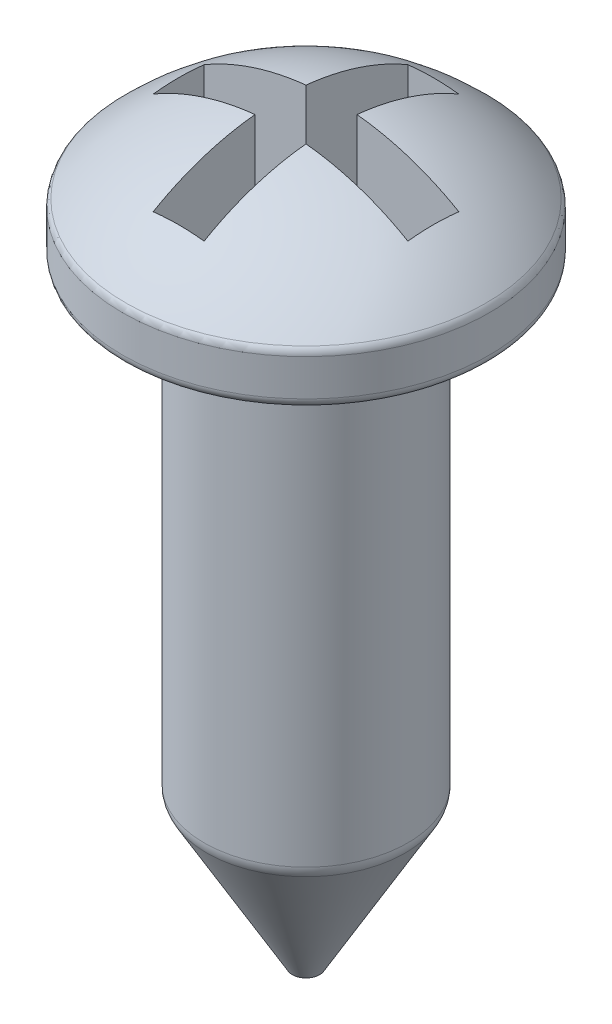
ISO-10303-21;
HEADER;
FILE_DESCRIPTION(('STEP AP214'),'2;1');
FILE_NAME('part.step','',(''),(''),'','','');
FILE_SCHEMA(('AUTOMOTIVE_DESIGN { 1 0 10303 214 1 1 1 1 }'));
ENDSEC;
DATA;
#1=APPLICATION_CONTEXT('core data for automotive mechanical design processes');
#2=APPLICATION_PROTOCOL_DEFINITION('international standard','automotive_design',2000,#1);
#3=PRODUCT_CONTEXT('',#1,'mechanical');
#4=PRODUCT('Part','Part','',(#3));
#5=PRODUCT_RELATED_PRODUCT_CATEGORY('part','',(#4));
#6=PRODUCT_DEFINITION_FORMATION('','',#4);
#7=PRODUCT_DEFINITION_CONTEXT('part definition',#1,'design');
#8=PRODUCT_DEFINITION('design','',#6,#7);
#9=PRODUCT_DEFINITION_SHAPE('','',#8);
#10=(LENGTH_UNIT() NAMED_UNIT(*) SI_UNIT(.MILLI.,.METRE.));
#11=(NAMED_UNIT(*) PLANE_ANGLE_UNIT() SI_UNIT($,.RADIAN.));
#12=(NAMED_UNIT(*) SI_UNIT($,.STERADIAN.) SOLID_ANGLE_UNIT());
#13=UNCERTAINTY_MEASURE_WITH_UNIT(LENGTH_MEASURE(1.E-05),#10,'distance_accuracy_value','');
#14=(GEOMETRIC_REPRESENTATION_CONTEXT(3) GLOBAL_UNCERTAINTY_ASSIGNED_CONTEXT((#13)) GLOBAL_UNIT_ASSIGNED_CONTEXT((#10,
#11,#12)) REPRESENTATION_CONTEXT('',''));
#15=CARTESIAN_POINT('',(0.,0.,0.));
#16=DIRECTION('',(0.,0.,1.));
#17=DIRECTION('',(1.,0.,0.));
#18=AXIS2_PLACEMENT_3D('',#15,#16,#17);
#19=CARTESIAN_POINT('',(0.,-1.2188961038961,0.));
#20=DIRECTION('',(0.,-1.,0.));
#21=DIRECTION('',(1.,0.,0.));
#22=AXIS2_PLACEMENT_3D('',#19,#20,#21);
#23=SPHERICAL_SURFACE('',#22,2.4888961038961);
#24=CARTESIAN_POINT('',(0.,0.529699603001643,0.));
#25=DIRECTION('',(0.,-1.,0.));
#26=DIRECTION('',(0.,0.,-1.));
#27=AXIS2_PLACEMENT_3D('',#24,#25,#26);
#28=CIRCLE('',#27,1.77116257576993);
#29=CARTESIAN_POINT('',(0.,0.529699603001643,-1.77116257576993));
#30=VERTEX_POINT('',#29);
#31=EDGE_CURVE('E197',#30,#30,#28,.F.);
#32=ORIENTED_EDGE('',*,*,#31,.T.);
#33=EDGE_LOOP('',(#32));
#34=FACE_BOUND('',#33,.T.);
#35=CARTESIAN_POINT('',(0.25,-1.2188961038961,0.));
#36=DIRECTION('',(-1.,0.,0.));
#37=DIRECTION('',(0.,0.,1.));
#38=AXIS2_PLACEMENT_3D('',#35,#36,#37);
#39=CIRCLE('',#38,2.47630850581853);
#40=CARTESIAN_POINT('',(0.25,1.24476049067815,-0.25));
#41=VERTEX_POINT('',#40);
#42=CARTESIAN_POINT('',(0.25,0.918767063206985,-1.25));
#43=VERTEX_POINT('',#42);
#44=EDGE_CURVE('E114',#41,#43,#39,.T.);
#45=ORIENTED_EDGE('',*,*,#44,.F.);
#46=CARTESIAN_POINT('',(0.,-1.2188961038961,-0.25));
#47=DIRECTION('',(0.,0.,-1.));
#48=DIRECTION('',(-1.,0.,0.));
#49=AXIS2_PLACEMENT_3D('',#46,#47,#48);
#50=CIRCLE('',#49,2.47630850581853);
#51=CARTESIAN_POINT('',(1.25,0.918767063206984,-0.25));
#52=VERTEX_POINT('',#51);
#53=EDGE_CURVE('E199',#41,#52,#50,.T.);
#54=ORIENTED_EDGE('',*,*,#53,.T.);
#55=CARTESIAN_POINT('',(1.25,-1.2188961038961,0.));
#56=DIRECTION('',(1.,0.,0.));
#57=DIRECTION('',(0.,0.,-1.));
#58=AXIS2_PLACEMENT_3D('',#55,#56,#57);
#59=CIRCLE('',#58,2.15223228671749);
#60=CARTESIAN_POINT('',(1.25,0.918767063206985,0.25));
#61=VERTEX_POINT('',#60);
#62=EDGE_CURVE('E204',#52,#61,#59,.T.);
#63=ORIENTED_EDGE('',*,*,#62,.T.);
#64=CARTESIAN_POINT('',(0.,-1.2188961038961,0.25));
#65=DIRECTION('',(0.,0.,1.));
#66=DIRECTION('',(1.,0.,0.));
#67=AXIS2_PLACEMENT_3D('',#64,#65,#66);
#68=CIRCLE('',#67,2.47630850581853);
#69=CARTESIAN_POINT('',(0.25,1.24476049067815,0.25));
#70=VERTEX_POINT('',#69);
#71=EDGE_CURVE('E208',#61,#70,#68,.T.);
#72=ORIENTED_EDGE('',*,*,#71,.T.);
#73=CARTESIAN_POINT('',(0.25,0.918767063206985,1.25));
#74=VERTEX_POINT('',#73);
#75=EDGE_CURVE('E151',#74,#70,#39,.T.);
#76=ORIENTED_EDGE('',*,*,#75,.F.);
#77=CARTESIAN_POINT('',(0.,-1.2188961038961,1.25));
#78=DIRECTION('',(0.,0.,-1.));
#79=DIRECTION('',(-1.,0.,0.));
#80=AXIS2_PLACEMENT_3D('',#77,#78,#79);
#81=CIRCLE('',#80,2.15223228671749);
#82=CARTESIAN_POINT('',(-0.25,0.918767063206985,1.25));
#83=VERTEX_POINT('',#82);
#84=EDGE_CURVE('E25',#83,#74,#81,.T.);
#85=ORIENTED_EDGE('',*,*,#84,.F.);
#86=CARTESIAN_POINT('',(-0.25,-1.2188961038961,0.));
#87=DIRECTION('',(1.,0.,0.));
#88=DIRECTION('',(0.,0.,-1.));
#89=AXIS2_PLACEMENT_3D('',#86,#87,#88);
#90=CIRCLE('',#89,2.47630850581853);
#91=CARTESIAN_POINT('',(-0.25,1.24476049067815,0.25));
#92=VERTEX_POINT('',#91);
#93=EDGE_CURVE('E144',#92,#83,#90,.T.);
#94=ORIENTED_EDGE('',*,*,#93,.F.);
#95=CARTESIAN_POINT('',(-1.25,0.918767063206985,0.25));
#96=VERTEX_POINT('',#95);
#97=EDGE_CURVE('E210',#92,#96,#68,.T.);
#98=ORIENTED_EDGE('',*,*,#97,.T.);
#99=CARTESIAN_POINT('',(-1.25,-1.2188961038961,0.));
#100=DIRECTION('',(-1.,0.,0.));
#101=DIRECTION('',(0.,0.,1.));
#102=AXIS2_PLACEMENT_3D('',#99,#100,#101);
#103=CIRCLE('',#102,2.15223228671749);
#104=CARTESIAN_POINT('',(-1.25,0.918767063206985,-0.25));
#105=VERTEX_POINT('',#104);
#106=EDGE_CURVE('E211',#96,#105,#103,.T.);
#107=ORIENTED_EDGE('',*,*,#106,.T.);
#108=CARTESIAN_POINT('',(-0.25,1.24476049067815,-0.25));
#109=VERTEX_POINT('',#108);
#110=EDGE_CURVE('E203',#105,#109,#50,.T.);
#111=ORIENTED_EDGE('',*,*,#110,.T.);
#112=CARTESIAN_POINT('',(-0.25,0.918767063206985,-1.25));
#113=VERTEX_POINT('',#112);
#114=EDGE_CURVE('E142',#113,#109,#90,.T.);
#115=ORIENTED_EDGE('',*,*,#114,.F.);
#116=CARTESIAN_POINT('',(0.,-1.2188961038961,-1.25));
#117=DIRECTION('',(0.,0.,1.));
#118=DIRECTION('',(1.,0.,0.));
#119=AXIS2_PLACEMENT_3D('',#116,#117,#118);
#120=CIRCLE('',#119,2.15223228671749);
#121=EDGE_CURVE('E11',#43,#113,#120,.T.);
#122=ORIENTED_EDGE('',*,*,#121,.F.);
#123=EDGE_LOOP('',(#45,#54,#63,#72,#76,#85,#94,#98,#107,#111,#115,#122));
#124=FACE_BOUND('',#123,.T.);
#125=ADVANCED_FACE('F17',(#34,#124),#23,.T.);
#126=CARTESIAN_POINT('',(1.25,5.1,0.25));
#127=DIRECTION('',(0.,0.,1.));
#128=DIRECTION('',(1.,0.,0.));
#129=AXIS2_PLACEMENT_3D('',#126,#127,#128);
#130=PLANE('',#129);
#131=DIRECTION('',(0.,-1.,0.));
#132=VECTOR('',#131,1.);
#133=CARTESIAN_POINT('',(0.25,5.1,0.25));
#134=LINE('',#133,#132);
#135=CARTESIAN_POINT('',(0.25,0.1,0.25));
#136=VERTEX_POINT('',#135);
#137=EDGE_CURVE('E147',#70,#136,#134,.T.);
#138=ORIENTED_EDGE('',*,*,#137,.F.);
#139=ORIENTED_EDGE('',*,*,#71,.F.);
#140=DIRECTION('',(0.,-1.,0.));
#141=VECTOR('',#140,1.);
#142=CARTESIAN_POINT('',(1.25,5.1,0.25));
#143=LINE('',#142,#141);
#144=CARTESIAN_POINT('',(1.25,0.1,0.25));
#145=VERTEX_POINT('',#144);
#146=EDGE_CURVE('E171',#61,#145,#143,.T.);
#147=ORIENTED_EDGE('',*,*,#146,.T.);
#148=DIRECTION('',(-1.,0.,0.));
#149=VECTOR('',#148,1.);
#150=CARTESIAN_POINT('',(1.25,0.1,0.25));
#151=LINE('',#150,#149);
#152=EDGE_CURVE('E162',#145,#136,#151,.T.);
#153=ORIENTED_EDGE('',*,*,#152,.T.);
#154=EDGE_LOOP('',(#138,#139,#147,#153));
#155=FACE_BOUND('',#154,.T.);
#156=ADVANCED_FACE('F229',(#155),#130,.F.);
#157=DIRECTION('',(0.,1.,0.));
#158=VECTOR('',#157,1.);
#159=CARTESIAN_POINT('',(-0.25,5.1,0.25));
#160=LINE('',#159,#158);
#161=CARTESIAN_POINT('',(-0.25,0.1,0.25));
#162=VERTEX_POINT('',#161);
#163=EDGE_CURVE('E145',#162,#92,#160,.T.);
#164=ORIENTED_EDGE('',*,*,#163,.F.);
#165=CARTESIAN_POINT('',(-1.25,0.1,0.25));
#166=VERTEX_POINT('',#165);
#167=EDGE_CURVE('E165',#162,#166,#151,.T.);
#168=ORIENTED_EDGE('',*,*,#167,.T.);
#169=DIRECTION('',(0.,-1.,0.));
#170=VECTOR('',#169,1.);
#171=CARTESIAN_POINT('',(-1.25,5.1,0.25));
#172=LINE('',#171,#170);
#173=EDGE_CURVE('E170',#96,#166,#172,.T.);
#174=ORIENTED_EDGE('',*,*,#173,.F.);
#175=ORIENTED_EDGE('',*,*,#97,.F.);
#176=EDGE_LOOP('',(#164,#168,#174,#175));
#177=FACE_BOUND('',#176,.T.);
#178=ADVANCED_FACE('F248',(#177),#130,.F.);
#179=CARTESIAN_POINT('',(1.25,5.1,-0.25));
#180=DIRECTION('',(0.,0.,-1.));
#181=DIRECTION('',(-1.,0.,0.));
#182=AXIS2_PLACEMENT_3D('',#179,#180,#181);
#183=PLANE('',#182);
#184=DIRECTION('',(0.,1.,0.));
#185=VECTOR('',#184,1.);
#186=CARTESIAN_POINT('',(0.25,5.1,-0.25));
#187=LINE('',#186,#185);
#188=CARTESIAN_POINT('',(0.25,0.1,-0.25));
#189=VERTEX_POINT('',#188);
#190=EDGE_CURVE('E150',#189,#41,#187,.T.);
#191=ORIENTED_EDGE('',*,*,#190,.F.);
#192=DIRECTION('',(1.,0.,0.));
#193=VECTOR('',#192,1.);
#194=CARTESIAN_POINT('',(1.25,0.1,-0.25));
#195=LINE('',#194,#193);
#196=CARTESIAN_POINT('',(1.25,0.1,-0.25));
#197=VERTEX_POINT('',#196);
#198=EDGE_CURVE('E121',#189,#197,#195,.T.);
#199=ORIENTED_EDGE('',*,*,#198,.T.);
#200=DIRECTION('',(0.,-1.,0.));
#201=VECTOR('',#200,1.);
#202=CARTESIAN_POINT('',(1.25,5.1,-0.25));
#203=LINE('',#202,#201);
#204=EDGE_CURVE('E174',#52,#197,#203,.T.);
#205=ORIENTED_EDGE('',*,*,#204,.F.);
#206=ORIENTED_EDGE('',*,*,#53,.F.);
#207=EDGE_LOOP('',(#191,#199,#205,#206));
#208=FACE_BOUND('',#207,.T.);
#209=ADVANCED_FACE('F235',(#208),#183,.F.);
#210=DIRECTION('',(0.,-1.,0.));
#211=VECTOR('',#210,1.);
#212=CARTESIAN_POINT('',(-0.25,5.1,-0.25));
#213=LINE('',#212,#211);
#214=CARTESIAN_POINT('',(-0.25,0.1,-0.25));
#215=VERTEX_POINT('',#214);
#216=EDGE_CURVE('E117',#109,#215,#213,.T.);
#217=ORIENTED_EDGE('',*,*,#216,.F.);
#218=ORIENTED_EDGE('',*,*,#110,.F.);
#219=DIRECTION('',(0.,-1.,0.));
#220=VECTOR('',#219,1.);
#221=CARTESIAN_POINT('',(-1.25,5.1,-0.25));
#222=LINE('',#221,#220);
#223=CARTESIAN_POINT('',(-1.25,0.1,-0.25));
#224=VERTEX_POINT('',#223);
#225=EDGE_CURVE('E167',#105,#224,#222,.T.);
#226=ORIENTED_EDGE('',*,*,#225,.T.);
#227=EDGE_CURVE('E156',#224,#215,#195,.T.);
#228=ORIENTED_EDGE('',*,*,#227,.T.);
#229=EDGE_LOOP('',(#217,#218,#226,#228));
#230=FACE_BOUND('',#229,.T.);
#231=ADVANCED_FACE('F239',(#230),#183,.F.);
#232=CARTESIAN_POINT('',(0.,0.,0.));
#233=DIRECTION('',(0.,1.,0.));
#234=DIRECTION('',(0.,0.,1.));
#235=AXIS2_PLACEMENT_3D('',#232,#233,#234);
#236=PLANE('',#235);
#237=CARTESIAN_POINT('',(0.,0.,0.));
#238=DIRECTION('',(0.,1.,0.));
#239=DIRECTION('',(0.,0.,1.));
#240=AXIS2_PLACEMENT_3D('',#237,#238,#239);
#241=CIRCLE('',#240,1.7);
#242=CARTESIAN_POINT('',(0.,0.,1.7));
#243=VERTEX_POINT('',#242);
#244=EDGE_CURVE('E187',#243,#243,#241,.F.);
#245=ORIENTED_EDGE('',*,*,#244,.T.);
#246=EDGE_LOOP('',(#245));
#247=FACE_BOUND('',#246,.T.);
#248=CARTESIAN_POINT('',(0.,0.,0.));
#249=DIRECTION('',(0.,1.,0.));
#250=DIRECTION('',(0.,0.,1.));
#251=AXIS2_PLACEMENT_3D('',#248,#249,#250);
#252=CIRCLE('',#251,1.);
#253=CARTESIAN_POINT('',(0.,0.,1.));
#254=VERTEX_POINT('',#253);
#255=EDGE_CURVE('E168',#254,#254,#252,.F.);
#256=ORIENTED_EDGE('',*,*,#255,.F.);
#257=EDGE_LOOP('',(#256));
#258=FACE_BOUND('',#257,.T.);
#259=ADVANCED_FACE('F296',(#247,#258),#236,.F.);
#260=CARTESIAN_POINT('',(0.,0.,0.));
#261=DIRECTION('',(0.,-1.,0.));
#262=DIRECTION('',(0.,0.,-1.));
#263=AXIS2_PLACEMENT_3D('',#260,#261,#262);
#264=CYLINDRICAL_SURFACE('',#263,1.8);
#265=CARTESIAN_POINT('',(0.,0.1,0.));
#266=DIRECTION('',(0.,1.,0.));
#267=DIRECTION('',(0.,0.,1.));
#268=AXIS2_PLACEMENT_3D('',#265,#266,#267);
#269=CIRCLE('',#268,1.8);
#270=CARTESIAN_POINT('',(0.,0.1,1.8));
#271=VERTEX_POINT('',#270);
#272=EDGE_CURVE('E191',#271,#271,#269,.T.);
#273=ORIENTED_EDGE('',*,*,#272,.T.);
#274=EDGE_LOOP('',(#273));
#275=FACE_BOUND('',#274,.T.);
#276=CARTESIAN_POINT('',(0.,0.459443729156185,0.));
#277=DIRECTION('',(0.,-1.,0.));
#278=DIRECTION('',(0.,0.,-1.));
#279=AXIS2_PLACEMENT_3D('',#276,#277,#278);
#280=CIRCLE('',#279,1.8);
#281=CARTESIAN_POINT('',(0.,0.459443729156185,-1.8));
#282=VERTEX_POINT('',#281);
#283=EDGE_CURVE('E192',#282,#282,#280,.T.);
#284=ORIENTED_EDGE('',*,*,#283,.T.);
#285=EDGE_LOOP('',(#284));
#286=FACE_BOUND('',#285,.T.);
#287=ADVANCED_FACE('F273',(#275,#286),#264,.T.);
#288=CARTESIAN_POINT('',(0.,-6.,0.));
#289=DIRECTION('',(0.,1.,0.));
#290=DIRECTION('',(0.,0.,1.));
#291=AXIS2_PLACEMENT_3D('',#288,#289,#290);
#292=CYLINDRICAL_SURFACE('',#291,1.);
#293=CARTESIAN_POINT('',(0.,-4.44641016151376,0.));
#294=DIRECTION('',(0.,-1.,0.));
#295=DIRECTION('',(0.,0.,-1.));
#296=AXIS2_PLACEMENT_3D('',#293,#294,#295);
#297=CIRCLE('',#296,1.);
#298=CARTESIAN_POINT('',(0.,-4.44641016151376,-1.));
#299=VERTEX_POINT('',#298);
#300=EDGE_CURVE('E181',#299,#299,#297,.F.);
#301=ORIENTED_EDGE('',*,*,#300,.T.);
#302=EDGE_LOOP('',(#301));
#303=FACE_BOUND('',#302,.T.);
#304=ORIENTED_EDGE('',*,*,#255,.T.);
#305=EDGE_LOOP('',(#304));
#306=FACE_BOUND('',#305,.T.);
#307=ADVANCED_FACE('F302',(#303,#306),#292,.T.);
#308=CARTESIAN_POINT('',(0.,-6.,0.));
#309=DIRECTION('',(0.,-1.,0.));
#310=DIRECTION('',(0.,0.,-1.));
#311=AXIS2_PLACEMENT_3D('',#308,#309,#310);
#312=PLANE('',#311);
#313=CARTESIAN_POINT('',(0.,-6.,0.));
#314=DIRECTION('',(0.,-1.,0.));
#315=DIRECTION('',(0.,0.,-1.));
#316=AXIS2_PLACEMENT_3D('',#313,#314,#315);
#317=CIRCLE('',#316,0.133974596215561);
#318=CARTESIAN_POINT('',(0.,-6.,0.133974596215561));
#319=VERTEX_POINT('',#318);
#320=EDGE_CURVE('E180',#319,#319,#317,.T.);
#321=ORIENTED_EDGE('',*,*,#320,.T.);
#322=EDGE_LOOP('',(#321));
#323=FACE_BOUND('',#322,.T.);
#324=ADVANCED_FACE('F278',(#323),#312,.T.);
#325=CARTESIAN_POINT('',(0.,-6.,0.));
#326=DIRECTION('',(0.,1.,0.));
#327=DIRECTION('',(0.,0.,1.));
#328=AXIS2_PLACEMENT_3D('',#325,#326,#327);
#329=CONICAL_SURFACE('',#328,0.133974596215561,0.523598775598298);
#330=CARTESIAN_POINT('',(0.,-4.54641016151377,0.));
#331=DIRECTION('',(0.,1.,0.));
#332=DIRECTION('',(0.,0.,1.));
#333=AXIS2_PLACEMENT_3D('',#330,#331,#332);
#334=CIRCLE('',#333,0.973205080756888);
#335=CARTESIAN_POINT('',(0.,-4.54641016151377,0.973205080756889));
#336=VERTEX_POINT('',#335);
#337=EDGE_CURVE('E184',#336,#336,#334,.F.);
#338=CARTESIAN_POINT('',(0.,-4.54641016151377,0.973205080756889));
#339=CARTESIAN_POINT('',(0.,-4.56155172233134,0.964463096542917));
#340=CARTESIAN_POINT('',(0.,-4.5766932831489,0.955721112328945));
#341=CARTESIAN_POINT('',(0.,-4.60697640478403,0.938237143901));
#342=CARTESIAN_POINT('',(0.,-4.62211796560159,0.929495159687028));
#343=CARTESIAN_POINT('',(0.,-4.65240108723672,0.912011191259083));
#344=CARTESIAN_POINT('',(0.,-4.66754264805429,0.903269207045111));
#345=CARTESIAN_POINT('',(0.,-4.69782576968942,0.885785238617167));
#346=CARTESIAN_POINT('',(0.,-4.71296733050698,0.877043254403195));
#347=CARTESIAN_POINT('',(0.,-4.74325045214211,0.85955928597525));
#348=CARTESIAN_POINT('',(0.,-4.75839201295968,0.850817301761278));
#349=CARTESIAN_POINT('',(0.,-4.78867513459481,0.833333333333334));
#350=CARTESIAN_POINT('',(0.,-4.80381669541237,0.824591349119362));
#351=CARTESIAN_POINT('',(0.,-4.8340998170475,0.807107380691418));
#352=CARTESIAN_POINT('',(0.,-4.84924137786507,0.798365396477445));
#353=CARTESIAN_POINT('',(0.,-4.8795244995002,0.780881428049501));
#354=CARTESIAN_POINT('',(0.,-4.89466606031776,0.772139443835529));
#355=CARTESIAN_POINT('',(0.,-4.92494918195289,0.754655475407584));
#356=CARTESIAN_POINT('',(0.,-4.94009074277046,0.745913491193612));
#357=CARTESIAN_POINT('',(0.,-4.97037386440559,0.728429522765668));
#358=CARTESIAN_POINT('',(0.,-4.98551542522315,0.719687538551696));
#359=CARTESIAN_POINT('',(0.,-5.01579854685828,0.702203570123751));
#360=CARTESIAN_POINT('',(0.,-5.03094010767585,0.693461585909779));
#361=CARTESIAN_POINT('',(0.,-5.06122322931098,0.675977617481835));
#362=CARTESIAN_POINT('',(0.,-5.07636479012854,0.667235633267863));
#363=CARTESIAN_POINT('',(0.,-5.10664791176367,0.649751664839919));
#364=CARTESIAN_POINT('',(0.,-5.12178947258124,0.641009680625946));
#365=CARTESIAN_POINT('',(0.,-5.15207259421637,0.623525712198002));
#366=CARTESIAN_POINT('',(0.,-5.16721415503393,0.61478372798403));
#367=CARTESIAN_POINT('',(0.,-5.19749727666906,0.597299759556086));
#368=CARTESIAN_POINT('',(0.,-5.21263883748663,0.588557775342114));
#369=CARTESIAN_POINT('',(0.,-5.24292195912176,0.571073806914169));
#370=CARTESIAN_POINT('',(0.,-5.25806351993932,0.562331822700197));
#371=CARTESIAN_POINT('',(0.,-5.28834664157445,0.544847854272253));
#372=CARTESIAN_POINT('',(0.,-5.30348820239201,0.53610587005828));
#373=CARTESIAN_POINT('',(0.,-5.33377132402714,0.518621901630336));
#374=CARTESIAN_POINT('',(0.,-5.34891288484471,0.509879917416364));
#375=CARTESIAN_POINT('',(0.,-5.37919600647984,0.49239594898842));
#376=CARTESIAN_POINT('',(0.,-5.3943375672974,0.483653964774447));
#377=CARTESIAN_POINT('',(0.,-5.42462068893253,0.466169996346503));
#378=CARTESIAN_POINT('',(0.,-5.4397622497501,0.457428012132531));
#379=CARTESIAN_POINT('',(0.,-5.47004537138523,0.439944043704587));
#380=CARTESIAN_POINT('',(0.,-5.48518693220279,0.431202059490614));
#381=CARTESIAN_POINT('',(0.,-5.51547005383792,0.41371809106267));
#382=CARTESIAN_POINT('',(0.,-5.53061161465549,0.404976106848698));
#383=CARTESIAN_POINT('',(0.,-5.56089473629062,0.387492138420754));
#384=CARTESIAN_POINT('',(0.,-5.57603629710818,0.378750154206781));
#385=CARTESIAN_POINT('',(0.,-5.60631941874331,0.361266185778837));
#386=CARTESIAN_POINT('',(0.,-5.62146097956088,0.352524201564865));
#387=CARTESIAN_POINT('',(0.,-5.65174410119601,0.335040233136921));
#388=CARTESIAN_POINT('',(0.,-5.66688566201357,0.326298248922948));
#389=CARTESIAN_POINT('',(0.,-5.6971687836487,0.308814280495004));
#390=CARTESIAN_POINT('',(0.,-5.71231034446627,0.300072296281032));
#391=CARTESIAN_POINT('',(0.,-5.7425934661014,0.282588327853088));
#392=CARTESIAN_POINT('',(0.,-5.75773502691896,0.273846343639115));
#393=CARTESIAN_POINT('',(0.,-5.78801814855409,0.256362375211171));
#394=CARTESIAN_POINT('',(0.,-5.80315970937166,0.247620390997199));
#395=CARTESIAN_POINT('',(0.,-5.83344283100679,0.230136422569255));
#396=CARTESIAN_POINT('',(0.,-5.84858439182435,0.221394438355282));
#397=CARTESIAN_POINT('',(0.,-5.87886751345948,0.203910469927338));
#398=CARTESIAN_POINT('',(0.,-5.89400907427705,0.195168485713366));
#399=CARTESIAN_POINT('',(0.,-5.92429219591218,0.177684517285422));
#400=CARTESIAN_POINT('',(0.,-5.93943375672974,0.16894253307145));
#401=CARTESIAN_POINT('',(0.,-5.96971687836487,0.151458564643505));
#402=CARTESIAN_POINT('',(0.,-5.98485843918243,0.142716580429533));
#403=CARTESIAN_POINT('',(0.,-6.,0.133974596215561));
#404=B_SPLINE_CURVE_WITH_KNOTS('',3,(#338,#339,#340,#341,#342,#343,#344,#345,#346,#347,#348,
#349,#350,#351,#352,#353,#354,#355,#356,#357,#358,#359,#360,#361,#362,#363,#364,#365,#366,#367,
#368,#369,#370,#371,#372,#373,#374,#375,#376,#377,#378,#379,#380,#381,#382,#383,#384,#385,#386,
#387,#388,#389,#390,#391,#392,#393,#394,#395,#396,#397,#398,#399,#400,#401,#402,#403),
.UNSPECIFIED.,.F.,.F.,(4,2,2,2,2,2,2,2,2,2,2,2,2,2,2,2,2,2,2,2,2,2,2,2,2,2,2,2,2,2,2,2,4),(0.,
0.0524519052838338,0.104903810567666,0.1573557158515,0.209807621135332,0.262259526419165,
0.314711431702998,0.367163336986831,0.419615242270664,0.472067147554498,0.524519052838331,
0.576970958122164,0.629422863405997,0.68187476868983,0.734326673973663,0.786778579257496,
0.839230484541329,0.891682389825162,0.944134295108995,0.996586200392828,1.04903810567666,
1.10149001096049,1.15394191624433,1.20639382152816,1.25884572681199,1.31129763209583,
1.36374953737966,1.41620144266349,1.46865334794733,1.52110525323116,1.57355715851499,
1.62600906379882,1.67846096908266),.UNSPECIFIED.);
#405=EDGE_CURVE('BSEAM277',#336,#319,#404,.T.);
#406=ORIENTED_EDGE('',*,*,#337,.T.);
#407=ORIENTED_EDGE('',*,*,#320,.F.);
#408=ORIENTED_EDGE('',*,*,#405,.T.);
#409=ORIENTED_EDGE('',*,*,#405,.F.);
#410=EDGE_LOOP('',(#406,#408,#407,#409));
#411=FACE_BOUND('',#410,.T.);
#412=ADVANCED_FACE('F277',(#411),#329,.T.);
#413=CARTESIAN_POINT('',(0.,-4.44641016151376,0.));
#414=DIRECTION('',(0.,-1.,0.));
#415=DIRECTION('',(0.,0.,-1.));
#416=AXIS2_PLACEMENT_3D('',#413,#414,#415);
#417=TOROIDAL_SURFACE('',#416,0.8,0.2);
#418=ORIENTED_EDGE('',*,*,#337,.F.);
#419=EDGE_LOOP('',(#418));
#420=FACE_BOUND('',#419,.T.);
#421=ORIENTED_EDGE('',*,*,#300,.F.);
#422=EDGE_LOOP('',(#421));
#423=FACE_BOUND('',#422,.T.);
#424=ADVANCED_FACE('F276',(#420,#423),#417,.T.);
#425=CARTESIAN_POINT('',(0.,0.1,0.));
#426=DIRECTION('',(0.,1.,0.));
#427=DIRECTION('',(0.,0.,1.));
#428=AXIS2_PLACEMENT_3D('',#425,#426,#427);
#429=TOROIDAL_SURFACE('',#428,1.7,0.1);
#430=ORIENTED_EDGE('',*,*,#272,.F.);
#431=EDGE_LOOP('',(#430));
#432=FACE_BOUND('',#431,.T.);
#433=ORIENTED_EDGE('',*,*,#244,.F.);
#434=EDGE_LOOP('',(#433));
#435=FACE_BOUND('',#434,.T.);
#436=ADVANCED_FACE('F284',(#432,#435),#429,.T.);
#437=CARTESIAN_POINT('',(0.,0.459443729156185,0.));
#438=DIRECTION('',(0.,-1.,0.));
#439=DIRECTION('',(0.,0.,-1.));
#440=AXIS2_PLACEMENT_3D('',#437,#438,#439);
#441=TOROIDAL_SURFACE('',#440,1.7,0.1);
#442=ORIENTED_EDGE('',*,*,#31,.F.);
#443=EDGE_LOOP('',(#442));
#444=FACE_BOUND('',#443,.T.);
#445=ORIENTED_EDGE('',*,*,#283,.F.);
#446=EDGE_LOOP('',(#445));
#447=FACE_BOUND('',#446,.T.);
#448=ADVANCED_FACE('F19',(#444,#447),#441,.T.);
#449=CARTESIAN_POINT('',(-1.25,5.1,0.25));
#450=DIRECTION('',(-1.,0.,0.));
#451=DIRECTION('',(0.,0.,1.));
#452=AXIS2_PLACEMENT_3D('',#449,#450,#451);
#453=PLANE('',#452);
#454=ORIENTED_EDGE('',*,*,#173,.T.);
#455=DIRECTION('',(0.,0.,-1.));
#456=VECTOR('',#455,1.);
#457=CARTESIAN_POINT('',(-1.25,0.1,0.25));
#458=LINE('',#457,#456);
#459=EDGE_CURVE('E153',#166,#224,#458,.T.);
#460=ORIENTED_EDGE('',*,*,#459,.T.);
#461=ORIENTED_EDGE('',*,*,#225,.F.);
#462=ORIENTED_EDGE('',*,*,#106,.F.);
#463=EDGE_LOOP('',(#454,#460,#461,#462));
#464=FACE_BOUND('',#463,.T.);
#465=ADVANCED_FACE('F243',(#464),#453,.F.);
#466=CARTESIAN_POINT('',(1.25,5.1,0.25));
#467=DIRECTION('',(1.,0.,0.));
#468=DIRECTION('',(0.,0.,-1.));
#469=AXIS2_PLACEMENT_3D('',#466,#467,#468);
#470=PLANE('',#469);
#471=ORIENTED_EDGE('',*,*,#204,.T.);
#472=DIRECTION('',(0.,0.,1.));
#473=VECTOR('',#472,1.);
#474=CARTESIAN_POINT('',(1.25,0.1,0.25));
#475=LINE('',#474,#473);
#476=EDGE_CURVE('E157',#197,#145,#475,.T.);
#477=ORIENTED_EDGE('',*,*,#476,.T.);
#478=ORIENTED_EDGE('',*,*,#146,.F.);
#479=ORIENTED_EDGE('',*,*,#62,.F.);
#480=EDGE_LOOP('',(#471,#477,#478,#479));
#481=FACE_BOUND('',#480,.T.);
#482=ADVANCED_FACE('F230',(#481),#470,.F.);
#483=CARTESIAN_POINT('',(0.,0.1,0.));
#484=DIRECTION('',(0.,1.,0.));
#485=DIRECTION('',(0.,0.,1.));
#486=AXIS2_PLACEMENT_3D('',#483,#484,#485);
#487=PLANE('',#486);
#488=ORIENTED_EDGE('',*,*,#167,.F.);
#489=DIRECTION('',(0.,0.,1.));
#490=VECTOR('',#489,1.);
#491=CARTESIAN_POINT('',(-0.25,0.1,1.25));
#492=LINE('',#491,#490);
#493=CARTESIAN_POINT('',(-0.25,0.1,1.25));
#494=VERTEX_POINT('',#493);
#495=EDGE_CURVE('E127',#162,#494,#492,.T.);
#496=ORIENTED_EDGE('',*,*,#495,.T.);
#497=DIRECTION('',(1.,0.,0.));
#498=VECTOR('',#497,1.);
#499=CARTESIAN_POINT('',(-0.25,0.1,1.25));
#500=LINE('',#499,#498);
#501=CARTESIAN_POINT('',(0.25,0.1,1.25));
#502=VERTEX_POINT('',#501);
#503=EDGE_CURVE('E133',#494,#502,#500,.T.);
#504=ORIENTED_EDGE('',*,*,#503,.T.);
#505=DIRECTION('',(0.,0.,-1.));
#506=VECTOR('',#505,1.);
#507=CARTESIAN_POINT('',(0.25,0.1,1.25));
#508=LINE('',#507,#506);
#509=EDGE_CURVE('E39',#502,#136,#508,.T.);
#510=ORIENTED_EDGE('',*,*,#509,.T.);
#511=ORIENTED_EDGE('',*,*,#152,.F.);
#512=ORIENTED_EDGE('',*,*,#476,.F.);
#513=ORIENTED_EDGE('',*,*,#198,.F.);
#514=CARTESIAN_POINT('',(0.25,0.1,-1.25));
#515=VERTEX_POINT('',#514);
#516=EDGE_CURVE('E109',#189,#515,#508,.T.);
#517=ORIENTED_EDGE('',*,*,#516,.T.);
#518=DIRECTION('',(-1.,0.,0.));
#519=VECTOR('',#518,1.);
#520=CARTESIAN_POINT('',(-0.25,0.1,-1.25));
#521=LINE('',#520,#519);
#522=CARTESIAN_POINT('',(-0.25,0.1,-1.25));
#523=VERTEX_POINT('',#522);
#524=EDGE_CURVE('E122',#515,#523,#521,.T.);
#525=ORIENTED_EDGE('',*,*,#524,.T.);
#526=EDGE_CURVE('E32',#523,#215,#492,.T.);
#527=ORIENTED_EDGE('',*,*,#526,.T.);
#528=ORIENTED_EDGE('',*,*,#227,.F.);
#529=ORIENTED_EDGE('',*,*,#459,.F.);
#530=EDGE_LOOP('',(#488,#496,#504,#510,#511,#512,#513,#517,#525,#527,#528,#529));
#531=FACE_BOUND('',#530,.T.);
#532=ADVANCED_FACE('F124',(#531),#487,.T.);
#533=CARTESIAN_POINT('',(-0.25,1.25741240192243,1.25));
#534=DIRECTION('',(1.,0.,0.));
#535=DIRECTION('',(0.,0.,-1.));
#536=AXIS2_PLACEMENT_3D('',#533,#534,#535);
#537=PLANE('',#536);
#538=ORIENTED_EDGE('',*,*,#114,.T.);
#539=ORIENTED_EDGE('',*,*,#216,.T.);
#540=ORIENTED_EDGE('',*,*,#526,.F.);
#541=DIRECTION('',(0.,-1.,0.));
#542=VECTOR('',#541,1.);
#543=CARTESIAN_POINT('',(-0.25,1.25741240192243,-1.25));
#544=LINE('',#543,#542);
#545=EDGE_CURVE('E119',#113,#523,#544,.T.);
#546=ORIENTED_EDGE('',*,*,#545,.F.);
#547=EDGE_LOOP('',(#538,#539,#540,#546));
#548=FACE_BOUND('',#547,.T.);
#549=ADVANCED_FACE('F236',(#548),#537,.T.);
#550=CARTESIAN_POINT('',(0.25,1.25741240192243,1.25));
#551=DIRECTION('',(-1.,0.,0.));
#552=DIRECTION('',(0.,0.,1.));
#553=AXIS2_PLACEMENT_3D('',#550,#551,#552);
#554=PLANE('',#553);
#555=ORIENTED_EDGE('',*,*,#44,.T.);
#556=DIRECTION('',(0.,-1.,0.));
#557=VECTOR('',#556,1.);
#558=CARTESIAN_POINT('',(0.25,1.25741240192243,-1.25));
#559=LINE('',#558,#557);
#560=EDGE_CURVE('E110',#43,#515,#559,.T.);
#561=ORIENTED_EDGE('',*,*,#560,.T.);
#562=ORIENTED_EDGE('',*,*,#516,.F.);
#563=ORIENTED_EDGE('',*,*,#190,.T.);
#564=EDGE_LOOP('',(#555,#561,#562,#563));
#565=FACE_BOUND('',#564,.T.);
#566=ADVANCED_FACE('F108',(#565),#554,.T.);
#567=CARTESIAN_POINT('',(-0.25,1.25741240192243,-1.25));
#568=DIRECTION('',(0.,0.,1.));
#569=DIRECTION('',(1.,0.,0.));
#570=AXIS2_PLACEMENT_3D('',#567,#568,#569);
#571=PLANE('',#570);
#572=ORIENTED_EDGE('',*,*,#121,.T.);
#573=ORIENTED_EDGE('',*,*,#545,.T.);
#574=ORIENTED_EDGE('',*,*,#524,.F.);
#575=ORIENTED_EDGE('',*,*,#560,.F.);
#576=EDGE_LOOP('',(#572,#573,#574,#575));
#577=FACE_BOUND('',#576,.T.);
#578=ADVANCED_FACE('F126',(#577),#571,.T.);
#579=CARTESIAN_POINT('',(-0.25,1.25741240192243,1.25));
#580=DIRECTION('',(0.,0.,-1.));
#581=DIRECTION('',(-1.,0.,0.));
#582=AXIS2_PLACEMENT_3D('',#579,#580,#581);
#583=PLANE('',#582);
#584=ORIENTED_EDGE('',*,*,#84,.T.);
#585=DIRECTION('',(0.,-1.,0.));
#586=VECTOR('',#585,1.);
#587=CARTESIAN_POINT('',(0.25,1.25741240192243,1.25));
#588=LINE('',#587,#586);
#589=EDGE_CURVE('E137',#74,#502,#588,.T.);
#590=ORIENTED_EDGE('',*,*,#589,.T.);
#591=ORIENTED_EDGE('',*,*,#503,.F.);
#592=DIRECTION('',(0.,-1.,0.));
#593=VECTOR('',#592,1.);
#594=CARTESIAN_POINT('',(-0.25,1.25741240192243,1.25));
#595=LINE('',#594,#593);
#596=EDGE_CURVE('E139',#83,#494,#595,.T.);
#597=ORIENTED_EDGE('',*,*,#596,.F.);
#598=EDGE_LOOP('',(#584,#590,#591,#597));
#599=FACE_BOUND('',#598,.T.);
#600=ADVANCED_FACE('F220',(#599),#583,.T.);
#601=ORIENTED_EDGE('',*,*,#75,.T.);
#602=ORIENTED_EDGE('',*,*,#137,.T.);
#603=ORIENTED_EDGE('',*,*,#509,.F.);
#604=ORIENTED_EDGE('',*,*,#589,.F.);
#605=EDGE_LOOP('',(#601,#602,#603,#604));
#606=FACE_BOUND('',#605,.T.);
#607=ADVANCED_FACE('F224',(#606),#554,.T.);
#608=ORIENTED_EDGE('',*,*,#93,.T.);
#609=ORIENTED_EDGE('',*,*,#596,.T.);
#610=ORIENTED_EDGE('',*,*,#495,.F.);
#611=ORIENTED_EDGE('',*,*,#163,.T.);
#612=EDGE_LOOP('',(#608,#609,#610,#611));
#613=FACE_BOUND('',#612,.T.);
#614=ADVANCED_FACE('F252',(#613),#537,.T.);
#615=CLOSED_SHELL('',(#125,#156,#178,#209,#231,#259,#287,#307,#324,#412,#424,#436,#448,#465,
#482,#532,#549,#566,#578,#600,#607,#614));
#616=MANIFOLD_SOLID_BREP('B1',#615);
#617=ADVANCED_BREP_SHAPE_REPRESENTATION('',(#18,#616),#14);
#618=SHAPE_DEFINITION_REPRESENTATION(#9,#617);
ENDSEC;
END-ISO-10303-21;
